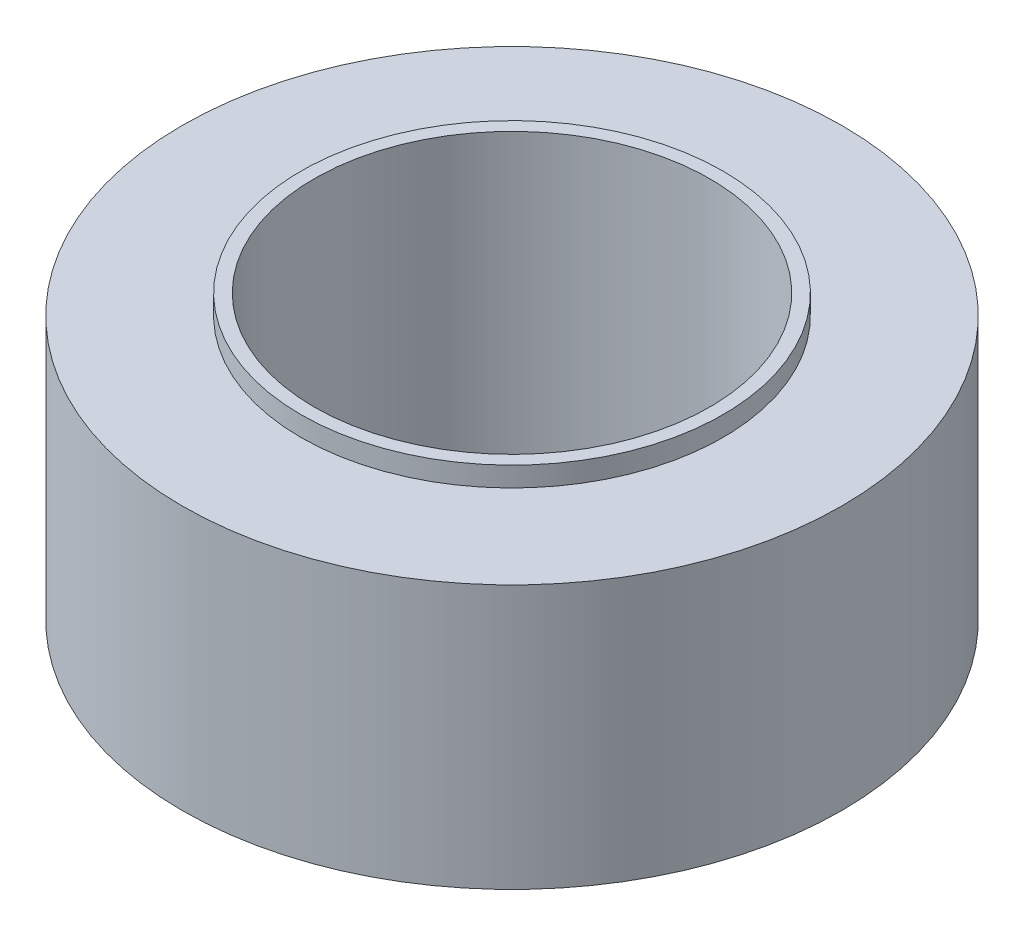
ISO-10303-21;
HEADER;
FILE_DESCRIPTION(('STEP AP214'),'2;1');
FILE_NAME('part.step','',(''),(''),'','','');
FILE_SCHEMA(('AUTOMOTIVE_DESIGN { 1 0 10303 214 1 1 1 1 }'));
ENDSEC;
DATA;
#1=APPLICATION_CONTEXT('core data for automotive mechanical design processes');
#2=APPLICATION_PROTOCOL_DEFINITION('international standard','automotive_design',2000,#1);
#3=PRODUCT_CONTEXT('',#1,'mechanical');
#4=PRODUCT('Part','Part','',(#3));
#5=PRODUCT_RELATED_PRODUCT_CATEGORY('part','',(#4));
#6=PRODUCT_DEFINITION_FORMATION('','',#4);
#7=PRODUCT_DEFINITION_CONTEXT('part definition',#1,'design');
#8=PRODUCT_DEFINITION('design','',#6,#7);
#9=PRODUCT_DEFINITION_SHAPE('','',#8);
#10=(LENGTH_UNIT() NAMED_UNIT(*) SI_UNIT(.MILLI.,.METRE.));
#11=(NAMED_UNIT(*) PLANE_ANGLE_UNIT() SI_UNIT($,.RADIAN.));
#12=(NAMED_UNIT(*) SI_UNIT($,.STERADIAN.) SOLID_ANGLE_UNIT());
#13=UNCERTAINTY_MEASURE_WITH_UNIT(LENGTH_MEASURE(1.E-05),#10,'distance_accuracy_value','');
#14=(GEOMETRIC_REPRESENTATION_CONTEXT(3) GLOBAL_UNCERTAINTY_ASSIGNED_CONTEXT((#13)) GLOBAL_UNIT_ASSIGNED_CONTEXT((#10,
#11,#12)) REPRESENTATION_CONTEXT('',''));
#15=CARTESIAN_POINT('',(0.,0.,0.));
#16=DIRECTION('',(0.,0.,1.));
#17=DIRECTION('',(1.,0.,0.));
#18=AXIS2_PLACEMENT_3D('',#15,#16,#17);
#19=CARTESIAN_POINT('',(0.,0.,0.));
#20=DIRECTION('',(0.,1.,0.));
#21=DIRECTION('',(0.,0.,1.));
#22=AXIS2_PLACEMENT_3D('',#19,#20,#21);
#23=PLANE('',#22);
#24=CARTESIAN_POINT('',(0.,0.,0.));
#25=DIRECTION('',(0.,1.,0.));
#26=DIRECTION('',(0.,0.,1.));
#27=AXIS2_PLACEMENT_3D('',#24,#25,#26);
#28=CIRCLE('',#27,12.5);
#29=CARTESIAN_POINT('',(0.,0.,12.5));
#30=VERTEX_POINT('',#29);
#31=EDGE_CURVE('E41',#30,#30,#28,.T.);
#32=ORIENTED_EDGE('',*,*,#31,.T.);
#33=EDGE_LOOP('',(#32));
#34=FACE_BOUND('',#33,.T.);
#35=CARTESIAN_POINT('',(0.,0.,0.));
#36=DIRECTION('',(0.,1.,0.));
#37=DIRECTION('',(0.,0.,1.));
#38=AXIS2_PLACEMENT_3D('',#35,#36,#37);
#39=CIRCLE('',#38,8.);
#40=CARTESIAN_POINT('',(0.,0.,8.));
#41=VERTEX_POINT('',#40);
#42=EDGE_CURVE('E56',#41,#41,#39,.T.);
#43=ORIENTED_EDGE('',*,*,#42,.F.);
#44=EDGE_LOOP('',(#43));
#45=FACE_BOUND('',#44,.T.);
#46=ADVANCED_FACE('F37',(#34,#45),#23,.T.);
#47=CARTESIAN_POINT('',(0.,-10.,0.));
#48=DIRECTION('',(0.,1.,0.));
#49=DIRECTION('',(0.,0.,1.));
#50=AXIS2_PLACEMENT_3D('',#47,#48,#49);
#51=CYLINDRICAL_SURFACE('',#50,12.5);
#52=CARTESIAN_POINT('',(0.,-10.,0.));
#53=DIRECTION('',(0.,1.,0.));
#54=DIRECTION('',(0.,0.,1.));
#55=AXIS2_PLACEMENT_3D('',#52,#53,#54);
#56=CIRCLE('',#55,12.5);
#57=CARTESIAN_POINT('',(0.,-10.,12.5));
#58=VERTEX_POINT('',#57);
#59=EDGE_CURVE('E10',#58,#58,#56,.T.);
#60=ORIENTED_EDGE('',*,*,#59,.T.);
#61=EDGE_LOOP('',(#60));
#62=FACE_BOUND('',#61,.T.);
#63=ORIENTED_EDGE('',*,*,#31,.F.);
#64=EDGE_LOOP('',(#63));
#65=FACE_BOUND('',#64,.T.);
#66=ADVANCED_FACE('F39',(#62,#65),#51,.T.);
#67=CARTESIAN_POINT('',(0.,-10.,0.));
#68=DIRECTION('',(0.,1.,0.));
#69=DIRECTION('',(0.,0.,1.));
#70=AXIS2_PLACEMENT_3D('',#67,#68,#69);
#71=PLANE('',#70);
#72=CARTESIAN_POINT('',(0.,-10.,0.));
#73=DIRECTION('',(0.,1.,0.));
#74=DIRECTION('',(0.,0.,1.));
#75=AXIS2_PLACEMENT_3D('',#72,#73,#74);
#76=CIRCLE('',#75,7.5);
#77=CARTESIAN_POINT('',(0.,-10.,7.5));
#78=VERTEX_POINT('',#77);
#79=EDGE_CURVE('E50',#78,#78,#76,.T.);
#80=ORIENTED_EDGE('',*,*,#79,.T.);
#81=EDGE_LOOP('',(#80));
#82=FACE_BOUND('',#81,.T.);
#83=ORIENTED_EDGE('',*,*,#59,.F.);
#84=EDGE_LOOP('',(#83));
#85=FACE_BOUND('',#84,.T.);
#86=ADVANCED_FACE('F81',(#82,#85),#71,.F.);
#87=CARTESIAN_POINT('',(0.,-10.,0.));
#88=DIRECTION('',(0.,1.,0.));
#89=DIRECTION('',(0.,0.,1.));
#90=AXIS2_PLACEMENT_3D('',#87,#88,#89);
#91=CYLINDRICAL_SURFACE('',#90,7.5);
#92=ORIENTED_EDGE('',*,*,#79,.F.);
#93=EDGE_LOOP('',(#92));
#94=FACE_BOUND('',#93,.T.);
#95=CARTESIAN_POINT('',(0.,0.75,0.));
#96=DIRECTION('',(0.,1.,0.));
#97=DIRECTION('',(0.,0.,1.));
#98=AXIS2_PLACEMENT_3D('',#95,#96,#97);
#99=CIRCLE('',#98,7.5);
#100=CARTESIAN_POINT('',(0.,0.75,7.5));
#101=VERTEX_POINT('',#100);
#102=EDGE_CURVE('E60',#101,#101,#99,.T.);
#103=ORIENTED_EDGE('',*,*,#102,.T.);
#104=EDGE_LOOP('',(#103));
#105=FACE_BOUND('',#104,.T.);
#106=ADVANCED_FACE('F68',(#94,#105),#91,.F.);
#107=CARTESIAN_POINT('',(0.,0.75,0.));
#108=DIRECTION('',(0.,1.,0.));
#109=DIRECTION('',(0.,0.,1.));
#110=AXIS2_PLACEMENT_3D('',#107,#108,#109);
#111=PLANE('',#110);
#112=CARTESIAN_POINT('',(0.,0.75,0.));
#113=DIRECTION('',(0.,1.,0.));
#114=DIRECTION('',(0.,0.,1.));
#115=AXIS2_PLACEMENT_3D('',#112,#113,#114);
#116=CIRCLE('',#115,8.);
#117=CARTESIAN_POINT('',(0.,0.75,8.));
#118=VERTEX_POINT('',#117);
#119=EDGE_CURVE('E55',#118,#118,#116,.T.);
#120=ORIENTED_EDGE('',*,*,#119,.T.);
#121=EDGE_LOOP('',(#120));
#122=FACE_BOUND('',#121,.T.);
#123=ORIENTED_EDGE('',*,*,#102,.F.);
#124=EDGE_LOOP('',(#123));
#125=FACE_BOUND('',#124,.T.);
#126=ADVANCED_FACE('F70',(#122,#125),#111,.T.);
#127=CARTESIAN_POINT('',(0.,0.75,0.));
#128=DIRECTION('',(0.,-1.,0.));
#129=DIRECTION('',(0.,0.,-1.));
#130=AXIS2_PLACEMENT_3D('',#127,#128,#129);
#131=CYLINDRICAL_SURFACE('',#130,8.);
#132=ORIENTED_EDGE('',*,*,#119,.F.);
#133=EDGE_LOOP('',(#132));
#134=FACE_BOUND('',#133,.T.);
#135=ORIENTED_EDGE('',*,*,#42,.T.);
#136=EDGE_LOOP('',(#135));
#137=FACE_BOUND('',#136,.T.);
#138=ADVANCED_FACE('F72',(#134,#137),#131,.T.);
#139=CLOSED_SHELL('',(#46,#66,#86,#106,#126,#138));
#140=MANIFOLD_SOLID_BREP('B2',#139);
#141=ADVANCED_BREP_SHAPE_REPRESENTATION('',(#18,#140),#14);
#142=SHAPE_DEFINITION_REPRESENTATION(#9,#141);
ENDSEC;
END-ISO-10303-21;
